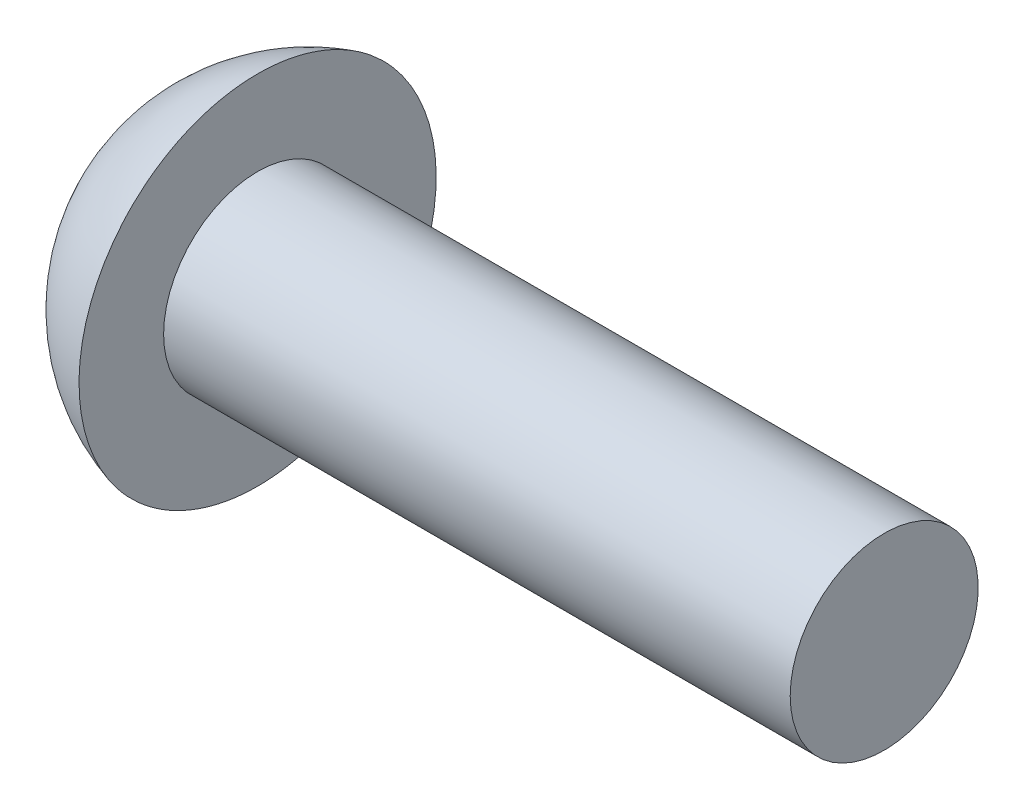
ISO-10303-21;
HEADER;
FILE_DESCRIPTION(('STEP AP214'),'2;1');
FILE_NAME('part.step','',(''),(''),'','','');
FILE_SCHEMA(('AUTOMOTIVE_DESIGN { 1 0 10303 214 1 1 1 1 }'));
ENDSEC;
DATA;
#1=APPLICATION_CONTEXT('core data for automotive mechanical design processes');
#2=APPLICATION_PROTOCOL_DEFINITION('international standard','automotive_design',2000,#1);
#3=PRODUCT_CONTEXT('',#1,'mechanical');
#4=PRODUCT('Part','Part','',(#3));
#5=PRODUCT_RELATED_PRODUCT_CATEGORY('part','',(#4));
#6=PRODUCT_DEFINITION_FORMATION('','',#4);
#7=PRODUCT_DEFINITION_CONTEXT('part definition',#1,'design');
#8=PRODUCT_DEFINITION('design','',#6,#7);
#9=PRODUCT_DEFINITION_SHAPE('','',#8);
#10=(LENGTH_UNIT() NAMED_UNIT(*) SI_UNIT(.MILLI.,.METRE.));
#11=(NAMED_UNIT(*) PLANE_ANGLE_UNIT() SI_UNIT($,.RADIAN.));
#12=(NAMED_UNIT(*) SI_UNIT($,.STERADIAN.) SOLID_ANGLE_UNIT());
#13=UNCERTAINTY_MEASURE_WITH_UNIT(LENGTH_MEASURE(1.E-05),#10,'distance_accuracy_value','');
#14=(GEOMETRIC_REPRESENTATION_CONTEXT(3) GLOBAL_UNCERTAINTY_ASSIGNED_CONTEXT((#13)) GLOBAL_UNIT_ASSIGNED_CONTEXT((#10,
#11,#12)) REPRESENTATION_CONTEXT('',''));
#15=CARTESIAN_POINT('',(0.,0.,0.));
#16=DIRECTION('',(0.,0.,1.));
#17=DIRECTION('',(1.,0.,0.));
#18=AXIS2_PLACEMENT_3D('',#15,#16,#17);
#19=CARTESIAN_POINT('',(1.04,-0.999999999999999,0.577350269189625));
#20=DIRECTION('',(0.86602540378444,-0.499999999999998,0.));
#21=DIRECTION('',(0.499999999999998,0.86602540378444,0.));
#22=AXIS2_PLACEMENT_3D('',#19,#20,#21);
#23=PLANE('',#22);
#24=DIRECTION('',(0.447213595499956,0.774596669241484,-0.447213595499959));
#25=VECTOR('',#24,1.);
#26=CARTESIAN_POINT('',(1.04,-0.999999999999999,0.577350269189625));
#27=LINE('',#26,#25);
#28=CARTESIAN_POINT('',(1.04,-0.999999999999999,0.577350269189625));
#29=VERTEX_POINT('',#28);
#30=CARTESIAN_POINT('',(1.61735026918962,0.,0.));
#31=VERTEX_POINT('',#30);
#32=EDGE_CURVE('E93',#29,#31,#27,.T.);
#33=ORIENTED_EDGE('',*,*,#32,.T.);
#34=DIRECTION('',(-0.447213595499956,-0.774596669241484,-0.447213595499959));
#35=VECTOR('',#34,1.);
#36=CARTESIAN_POINT('',(1.61735026918962,0.,0.));
#37=LINE('',#36,#35);
#38=CARTESIAN_POINT('',(1.04,-0.999999999999999,-0.577350269189628));
#39=VERTEX_POINT('',#38);
#40=EDGE_CURVE('E96',#31,#39,#37,.T.);
#41=ORIENTED_EDGE('',*,*,#40,.T.);
#42=DIRECTION('',(0.,0.,1.));
#43=VECTOR('',#42,1.);
#44=CARTESIAN_POINT('',(1.04,-0.999999999999999,0.577350269189625));
#45=LINE('',#44,#43);
#46=EDGE_CURVE('E91',#29,#39,#45,.F.);
#47=ORIENTED_EDGE('',*,*,#46,.F.);
#48=EDGE_LOOP('',(#33,#41,#47));
#49=FACE_BOUND('',#48,.T.);
#50=ADVANCED_FACE('F39',(#49),#23,.F.);
#51=CARTESIAN_POINT('',(1.04,0.,1.15470053837925));
#52=DIRECTION('',(0.86602540378444,-0.249999999999999,0.433012701892218));
#53=DIRECTION('',(0.447213595499956,0.,-0.894427190999917));
#54=AXIS2_PLACEMENT_3D('',#51,#52,#53);
#55=PLANE('',#54);
#56=DIRECTION('',(0.447213595499956,0.,-0.894427190999917));
#57=VECTOR('',#56,1.);
#58=CARTESIAN_POINT('',(1.27094010767585,0.,0.692820323027549));
#59=LINE('',#58,#57);
#60=CARTESIAN_POINT('',(1.04,0.,1.15470053837925));
#61=VERTEX_POINT('',#60);
#62=EDGE_CURVE('E100',#61,#31,#59,.T.);
#63=ORIENTED_EDGE('',*,*,#62,.T.);
#64=ORIENTED_EDGE('',*,*,#32,.F.);
#65=DIRECTION('',(0.,0.866025403784439,0.5));
#66=VECTOR('',#65,1.);
#67=CARTESIAN_POINT('',(1.04,0.,1.15470053837925));
#68=LINE('',#67,#66);
#69=EDGE_CURVE('E107',#61,#29,#68,.F.);
#70=ORIENTED_EDGE('',*,*,#69,.F.);
#71=EDGE_LOOP('',(#63,#64,#70));
#72=FACE_BOUND('',#71,.T.);
#73=ADVANCED_FACE('F105',(#72),#55,.F.);
#74=CARTESIAN_POINT('',(1.04,1.,0.577350269189625));
#75=DIRECTION('',(0.86602540378444,0.249999999999999,0.433012701892218));
#76=DIRECTION('',(0.447213595499956,0.,-0.894427190999917));
#77=AXIS2_PLACEMENT_3D('',#74,#75,#76);
#78=PLANE('',#77);
#79=DIRECTION('',(0.447213595499956,-0.774596669241484,-0.447213595499959));
#80=VECTOR('',#79,1.);
#81=CARTESIAN_POINT('',(1.04,1.,0.577350269189625));
#82=LINE('',#81,#80);
#83=CARTESIAN_POINT('',(1.04,1.,0.577350269189625));
#84=VERTEX_POINT('',#83);
#85=EDGE_CURVE('E111',#84,#31,#82,.T.);
#86=ORIENTED_EDGE('',*,*,#85,.T.);
#87=ORIENTED_EDGE('',*,*,#62,.F.);
#88=DIRECTION('',(0.,0.866025403784439,-0.5));
#89=VECTOR('',#88,1.);
#90=CARTESIAN_POINT('',(1.04,1.,0.577350269189625));
#91=LINE('',#90,#89);
#92=EDGE_CURVE('E117',#84,#61,#91,.F.);
#93=ORIENTED_EDGE('',*,*,#92,.F.);
#94=EDGE_LOOP('',(#86,#87,#93));
#95=FACE_BOUND('',#94,.T.);
#96=ADVANCED_FACE('F115',(#95),#78,.F.);
#97=CARTESIAN_POINT('',(1.04,1.,-0.577350269189626));
#98=DIRECTION('',(0.86602540378444,0.499999999999998,0.));
#99=DIRECTION('',(-0.499999999999998,0.86602540378444,0.));
#100=AXIS2_PLACEMENT_3D('',#97,#98,#99);
#101=PLANE('',#100);
#102=DIRECTION('',(0.447213595499956,-0.774596669241485,0.447213595499957));
#103=VECTOR('',#102,1.);
#104=CARTESIAN_POINT('',(1.04,1.,-0.577350269189626));
#105=LINE('',#104,#103);
#106=CARTESIAN_POINT('',(1.04,1.,-0.577350269189626));
#107=VERTEX_POINT('',#106);
#108=EDGE_CURVE('E121',#107,#31,#105,.T.);
#109=ORIENTED_EDGE('',*,*,#108,.T.);
#110=ORIENTED_EDGE('',*,*,#85,.F.);
#111=DIRECTION('',(0.,0.,-1.));
#112=VECTOR('',#111,1.);
#113=CARTESIAN_POINT('',(1.04,1.,-0.577350269189626));
#114=LINE('',#113,#112);
#115=EDGE_CURVE('E127',#107,#84,#114,.F.);
#116=ORIENTED_EDGE('',*,*,#115,.F.);
#117=EDGE_LOOP('',(#109,#110,#116));
#118=FACE_BOUND('',#117,.T.);
#119=ADVANCED_FACE('F125',(#118),#101,.F.);
#120=CARTESIAN_POINT('',(1.04,0.,-1.15470053837925));
#121=DIRECTION('',(0.86602540378444,0.249999999999999,-0.433012701892218));
#122=DIRECTION('',(-0.447213595499956,0.,-0.894427190999917));
#123=AXIS2_PLACEMENT_3D('',#120,#121,#122);
#124=PLANE('',#123);
#125=DIRECTION('',(-0.447213595499956,0.,-0.894427190999917));
#126=VECTOR('',#125,1.);
#127=CARTESIAN_POINT('',(1.27094010767585,0.,-0.692820323027552));
#128=LINE('',#127,#126);
#129=CARTESIAN_POINT('',(1.04,0.,-1.15470053837925));
#130=VERTEX_POINT('',#129);
#131=EDGE_CURVE('E131',#130,#31,#128,.F.);
#132=ORIENTED_EDGE('',*,*,#131,.T.);
#133=ORIENTED_EDGE('',*,*,#108,.F.);
#134=DIRECTION('',(0.,-0.866025403784439,-0.5));
#135=VECTOR('',#134,1.);
#136=CARTESIAN_POINT('',(1.04,0.,-1.15470053837925));
#137=LINE('',#136,#135);
#138=EDGE_CURVE('E136',#130,#107,#137,.F.);
#139=ORIENTED_EDGE('',*,*,#138,.F.);
#140=EDGE_LOOP('',(#132,#133,#139));
#141=FACE_BOUND('',#140,.T.);
#142=ADVANCED_FACE('F134',(#141),#124,.F.);
#143=CARTESIAN_POINT('',(1.04,-0.999999999999999,-0.577350269189628));
#144=DIRECTION('',(0.86602540378444,-0.249999999999999,-0.433012701892218));
#145=DIRECTION('',(-0.447213595499956,0.,-0.894427190999917));
#146=AXIS2_PLACEMENT_3D('',#143,#144,#145);
#147=PLANE('',#146);
#148=ORIENTED_EDGE('',*,*,#40,.F.);
#149=ORIENTED_EDGE('',*,*,#131,.F.);
#150=DIRECTION('',(0.,-0.866025403784439,0.5));
#151=VECTOR('',#150,1.);
#152=CARTESIAN_POINT('',(1.04,-0.999999999999999,-0.577350269189628));
#153=LINE('',#152,#151);
#154=EDGE_CURVE('E143',#39,#130,#153,.F.);
#155=ORIENTED_EDGE('',*,*,#154,.F.);
#156=EDGE_LOOP('',(#148,#149,#155));
#157=FACE_BOUND('',#156,.T.);
#158=ADVANCED_FACE('F141',(#157),#147,.F.);
#159=CARTESIAN_POINT('',(1.04,-0.999999999999999,0.577350269189625));
#160=DIRECTION('',(0.,1.,0.));
#161=DIRECTION('',(0.,0.,1.));
#162=AXIS2_PLACEMENT_3D('',#159,#160,#161);
#163=PLANE('',#162);
#164=ORIENTED_EDGE('',*,*,#46,.T.);
#165=DIRECTION('',(1.,0.,0.));
#166=VECTOR('',#165,1.);
#167=CARTESIAN_POINT('',(1.04,-0.999999999999999,-0.577350269189628));
#168=LINE('',#167,#166);
#169=CARTESIAN_POINT('',(0.,-0.999999999999999,-0.577350269189628));
#170=VERTEX_POINT('',#169);
#171=EDGE_CURVE('E194',#170,#39,#168,.T.);
#172=ORIENTED_EDGE('',*,*,#171,.F.);
#173=DIRECTION('',(0.,0.,-1.));
#174=VECTOR('',#173,1.);
#175=CARTESIAN_POINT('',(0.,-0.999999999999999,0.));
#176=LINE('',#175,#174);
#177=CARTESIAN_POINT('',(0.,-0.999999999999999,0.577350269189625));
#178=VERTEX_POINT('',#177);
#179=EDGE_CURVE('E191',#170,#178,#176,.F.);
#180=ORIENTED_EDGE('',*,*,#179,.T.);
#181=DIRECTION('',(1.,0.,0.));
#182=VECTOR('',#181,1.);
#183=CARTESIAN_POINT('',(1.04,-0.999999999999999,0.577350269189625));
#184=LINE('',#183,#182);
#185=EDGE_CURVE('E216',#29,#178,#184,.F.);
#186=ORIENTED_EDGE('',*,*,#185,.F.);
#187=EDGE_LOOP('',(#164,#172,#180,#186));
#188=FACE_BOUND('',#187,.T.);
#189=ADVANCED_FACE('F330',(#188),#163,.T.);
#190=CARTESIAN_POINT('',(1.04,0.,1.15470053837925));
#191=DIRECTION('',(0.,0.5,-0.866025403784439));
#192=DIRECTION('',(0.,0.866025403784439,0.5));
#193=AXIS2_PLACEMENT_3D('',#190,#191,#192);
#194=PLANE('',#193);
#195=ORIENTED_EDGE('',*,*,#69,.T.);
#196=ORIENTED_EDGE('',*,*,#185,.T.);
#197=DIRECTION('',(0.,0.866025403784439,0.5));
#198=VECTOR('',#197,1.);
#199=CARTESIAN_POINT('',(0.,-0.999999999999999,0.577350269189625));
#200=LINE('',#199,#198);
#201=CARTESIAN_POINT('',(0.,0.,1.15470053837925));
#202=VERTEX_POINT('',#201);
#203=EDGE_CURVE('E187',#178,#202,#200,.T.);
#204=ORIENTED_EDGE('',*,*,#203,.T.);
#205=DIRECTION('',(1.,0.,0.));
#206=VECTOR('',#205,1.);
#207=CARTESIAN_POINT('',(1.04,0.,1.15470053837925));
#208=LINE('',#207,#206);
#209=EDGE_CURVE('E210',#61,#202,#208,.F.);
#210=ORIENTED_EDGE('',*,*,#209,.F.);
#211=EDGE_LOOP('',(#195,#196,#204,#210));
#212=FACE_BOUND('',#211,.T.);
#213=ADVANCED_FACE('F222',(#212),#194,.T.);
#214=CARTESIAN_POINT('',(1.04,1.,0.577350269189625));
#215=DIRECTION('',(0.,-0.5,-0.866025403784439));
#216=DIRECTION('',(0.,0.866025403784439,-0.5));
#217=AXIS2_PLACEMENT_3D('',#214,#215,#216);
#218=PLANE('',#217);
#219=ORIENTED_EDGE('',*,*,#92,.T.);
#220=ORIENTED_EDGE('',*,*,#209,.T.);
#221=DIRECTION('',(0.,0.866025403784439,-0.5));
#222=VECTOR('',#221,1.);
#223=CARTESIAN_POINT('',(0.,0.,1.15470053837925));
#224=LINE('',#223,#222);
#225=CARTESIAN_POINT('',(0.,1.,0.577350269189625));
#226=VERTEX_POINT('',#225);
#227=EDGE_CURVE('E182',#202,#226,#224,.T.);
#228=ORIENTED_EDGE('',*,*,#227,.T.);
#229=DIRECTION('',(1.,0.,0.));
#230=VECTOR('',#229,1.);
#231=CARTESIAN_POINT('',(1.04,1.,0.577350269189625));
#232=LINE('',#231,#230);
#233=EDGE_CURVE('E204',#84,#226,#232,.F.);
#234=ORIENTED_EDGE('',*,*,#233,.F.);
#235=EDGE_LOOP('',(#219,#220,#228,#234));
#236=FACE_BOUND('',#235,.T.);
#237=ADVANCED_FACE('F226',(#236),#218,.T.);
#238=CARTESIAN_POINT('',(1.04,1.,-0.577350269189626));
#239=DIRECTION('',(0.,-1.,0.));
#240=DIRECTION('',(0.,0.,-1.));
#241=AXIS2_PLACEMENT_3D('',#238,#239,#240);
#242=PLANE('',#241);
#243=ORIENTED_EDGE('',*,*,#115,.T.);
#244=ORIENTED_EDGE('',*,*,#233,.T.);
#245=DIRECTION('',(0.,0.,-1.));
#246=VECTOR('',#245,1.);
#247=CARTESIAN_POINT('',(0.,1.,0.));
#248=LINE('',#247,#246);
#249=CARTESIAN_POINT('',(0.,1.,-0.577350269189626));
#250=VERTEX_POINT('',#249);
#251=EDGE_CURVE('E178',#226,#250,#248,.T.);
#252=ORIENTED_EDGE('',*,*,#251,.T.);
#253=DIRECTION('',(1.,0.,0.));
#254=VECTOR('',#253,1.);
#255=CARTESIAN_POINT('',(1.04,1.,-0.577350269189626));
#256=LINE('',#255,#254);
#257=EDGE_CURVE('E199',#107,#250,#256,.F.);
#258=ORIENTED_EDGE('',*,*,#257,.F.);
#259=EDGE_LOOP('',(#243,#244,#252,#258));
#260=FACE_BOUND('',#259,.T.);
#261=ADVANCED_FACE('F229',(#260),#242,.T.);
#262=CARTESIAN_POINT('',(1.04,0.,-1.15470053837925));
#263=DIRECTION('',(0.,-0.5,0.866025403784439));
#264=DIRECTION('',(0.,-0.866025403784439,-0.5));
#265=AXIS2_PLACEMENT_3D('',#262,#263,#264);
#266=PLANE('',#265);
#267=ORIENTED_EDGE('',*,*,#138,.T.);
#268=ORIENTED_EDGE('',*,*,#257,.T.);
#269=DIRECTION('',(0.,-0.866025403784439,-0.5));
#270=VECTOR('',#269,1.);
#271=CARTESIAN_POINT('',(0.,1.,-0.577350269189626));
#272=LINE('',#271,#270);
#273=CARTESIAN_POINT('',(0.,0.,-1.15470053837925));
#274=VERTEX_POINT('',#273);
#275=EDGE_CURVE('E55',#250,#274,#272,.T.);
#276=ORIENTED_EDGE('',*,*,#275,.T.);
#277=DIRECTION('',(1.,0.,0.));
#278=VECTOR('',#277,1.);
#279=CARTESIAN_POINT('',(1.04,0.,-1.15470053837925));
#280=LINE('',#279,#278);
#281=EDGE_CURVE('E231',#130,#274,#280,.F.);
#282=ORIENTED_EDGE('',*,*,#281,.F.);
#283=EDGE_LOOP('',(#267,#268,#276,#282));
#284=FACE_BOUND('',#283,.T.);
#285=ADVANCED_FACE('F230',(#284),#266,.T.);
#286=CARTESIAN_POINT('',(1.04,-0.999999999999999,-0.577350269189628));
#287=DIRECTION('',(0.,0.5,0.866025403784439));
#288=DIRECTION('',(0.,-0.866025403784439,0.5));
#289=AXIS2_PLACEMENT_3D('',#286,#287,#288);
#290=PLANE('',#289);
#291=ORIENTED_EDGE('',*,*,#154,.T.);
#292=ORIENTED_EDGE('',*,*,#281,.T.);
#293=DIRECTION('',(0.,-0.866025403784439,0.5));
#294=VECTOR('',#293,1.);
#295=CARTESIAN_POINT('',(0.,0.,-1.15470053837925));
#296=LINE('',#295,#294);
#297=EDGE_CURVE('E256',#274,#170,#296,.T.);
#298=ORIENTED_EDGE('',*,*,#297,.T.);
#299=ORIENTED_EDGE('',*,*,#171,.T.);
#300=EDGE_LOOP('',(#291,#292,#298,#299));
#301=FACE_BOUND('',#300,.T.);
#302=ADVANCED_FACE('F236',(#301),#290,.T.);
#303=CARTESIAN_POINT('',(0.,0.,0.));
#304=DIRECTION('',(1.,0.,0.));
#305=DIRECTION('',(0.,0.,-1.));
#306=AXIS2_PLACEMENT_3D('',#303,#304,#305);
#307=PLANE('',#306);
#308=ORIENTED_EDGE('',*,*,#275,.F.);
#309=ORIENTED_EDGE('',*,*,#251,.F.);
#310=ORIENTED_EDGE('',*,*,#227,.F.);
#311=ORIENTED_EDGE('',*,*,#203,.F.);
#312=ORIENTED_EDGE('',*,*,#179,.F.);
#313=ORIENTED_EDGE('',*,*,#297,.F.);
#314=EDGE_LOOP('',(#308,#309,#310,#311,#312,#313));
#315=FACE_BOUND('',#314,.T.);
#316=CARTESIAN_POINT('',(0.,1.65,0.));
#317=CARTESIAN_POINT('',(0.,1.64999475628625,0.0926122838063657));
#318=CARTESIAN_POINT('',(3.05898607916328E-13,1.64215978150358,0.18538939125107));
#319=CARTESIAN_POINT('',(-1.53351340608703E-13,1.61884585818146,0.322500922932766));
#320=CARTESIAN_POINT('',(-4.50330102517895E-13,1.60912731006566,0.367920519535546));
#321=CARTESIAN_POINT('',(4.50696310098876E-13,1.58589151201533,0.457824431536528));
#322=CARTESIAN_POINT('',(1.64991739910174E-12,1.57237117941051,0.502307956330261));
#323=CARTESIAN_POINT('',(2.73007966094236E-12,1.52629349808163,0.633652728784909));
#324=CARTESIAN_POINT('',(1.11209753632811E-13,1.48818162061822,0.718629249529157));
#325=CARTESIAN_POINT('',(-1.11213981633305E-13,1.39821389709384,0.88097098656055));
#326=CARTESIAN_POINT('',(2.28542286774844E-12,1.34635752856629,0.958335913356376));
#327=CARTESIAN_POINT('',(1.43558397308643E-12,1.25943801543863,1.06699419444925));
#328=CARTESIAN_POINT('',(4.09377236579174E-13,1.22891940035784,1.10200257307872));
#329=CARTESIAN_POINT('',(-4.08982535264704E-13,1.16507583146925,1.16929371559786));
#330=CARTESIAN_POINT('',(-2.02324430288588E-13,1.13175361176435,1.20157907484735));
#331=CARTESIAN_POINT('',(4.04519047964304E-13,1.02784793386739,1.29406800558064));
#332=CARTESIAN_POINT('',(7.91714517445034E-13,0.953306618166003,1.34992793323473));
#333=CARTESIAN_POINT('',(6.41169912511176E-13,0.795944396186136,1.44830738351795));
#334=CARTESIAN_POINT('',(1.03464719658415E-13,0.713123802262043,1.4908274091746));
#335=CARTESIAN_POINT('',(-1.0346361458411E-13,0.541510433473779,1.56136736420223));
#336=CARTESIAN_POINT('',(2.27303968102346E-13,0.452717722406053,1.58938744843934));
#337=CARTESIAN_POINT('',(3.00052162846325E-13,0.271690468516389,1.63012070855377));
#338=CARTESIAN_POINT('',(0.,0.179455907316224,1.64283380268526));
#339=CARTESIAN_POINT('',(0.,-0.00583846643853407,1.65259590893401));
#340=CARTESIAN_POINT('',(1.31933640701098E-13,-0.0988982789931269,1.64964492105128));
#341=CARTESIAN_POINT('',(1.59499829655953E-13,-0.283203510106528,1.62815895087065));
#342=CARTESIAN_POINT('',(0.,-0.374448938352222,1.60962405179717));
#343=CARTESIAN_POINT('',(0.,-0.552524395791296,1.55750721133294));
#344=CARTESIAN_POINT('',(1.07084564198388E-13,-0.639354377814266,1.52392510922982));
#345=CARTESIAN_POINT('',(1.39246775868807E-13,-0.806182871135907,1.44262542312685));
#346=CARTESIAN_POINT('',(0.,-0.886181124665969,1.39490730606296));
#347=CARTESIAN_POINT('',(0.,-0.999230046467636,1.31384847874074));
#348=CARTESIAN_POINT('',(0.,-1.03576024500621,1.28524324595618));
#349=CARTESIAN_POINT('',(0.,-1.10632113082031,1.2250331094087));
#350=CARTESIAN_POINT('',(1.42646866616883E-13,-1.14034937184121,1.19342533736241));
#351=CARTESIAN_POINT('',(2.50641519805975E-13,-1.23820518896636,1.09450181706908));
#352=CARTESIAN_POINT('',(0.,-1.29790375712784,1.02301408515312));
#353=CARTESIAN_POINT('',(0.,-1.40443180464718,0.871024592258884));
#354=CARTESIAN_POINT('',(0.,-1.45126177316042,0.790523174068533));
#355=CARTESIAN_POINT('',(0.,-1.51088568274003,0.664747217008587));
#356=CARTESIAN_POINT('',(0.,-1.5290053618036,0.621930624401761));
#357=CARTESIAN_POINT('',(0.,-1.56155935882147,0.534965959265291));
#358=CARTESIAN_POINT('',(0.,-1.57599665930636,0.490818996881043));
#359=CARTESIAN_POINT('',(0.,-1.61358878249043,0.356916258240854));
#360=CARTESIAN_POINT('',(0.,-1.63112912042799,0.265476031640657));
#361=CARTESIAN_POINT('',(0.,-1.64391044500751,0.144577174972478));
#362=CARTESIAN_POINT('',(0.,-1.64619205712785,0.115712936486685));
#363=CARTESIAN_POINT('',(0.,-1.64923765449147,0.0579045043900754));
#364=CARTESIAN_POINT('',(0.,-1.65000163973475,0.0289603107792577));
#365=CARTESIAN_POINT('',(0.,-1.64999475628625,-0.0926122838063663));
#366=CARTESIAN_POINT('',(3.06231663189347E-13,-1.64215978150358,-0.185389391251071));
#367=CARTESIAN_POINT('',(-1.53518305973345E-13,-1.61884585818146,-0.322500922932767));
#368=CARTESIAN_POINT('',(-4.5071564679152E-13,-1.60912731006566,-0.367920519535547));
#369=CARTESIAN_POINT('',(4.51082167896369E-13,-1.58589151201533,-0.457824431536529));
#370=CARTESIAN_POINT('',(1.65129422082248E-12,-1.57237117941051,-0.502307956330262));
#371=CARTESIAN_POINT('',(2.73252848185343E-12,-1.52629349808163,-0.633652728784909));
#372=CARTESIAN_POINT('',(1.11852479852063E-13,-1.48818162061822,-0.718629249529158));
#373=CARTESIAN_POINT('',(-1.11856732287884E-13,-1.39821389709384,-0.88097098656055));
#374=CARTESIAN_POINT('',(2.28530082337201E-12,-1.34635752856629,-0.958335913356375));
#375=CARTESIAN_POINT('',(1.4356450752365E-12,-1.25943801543863,-1.06699419444925));
#376=CARTESIAN_POINT('',(4.09399514034752E-13,-1.22891940035784,-1.10200257307872));
#377=CARTESIAN_POINT('',(-4.09004791241459E-13,-1.16507583146925,-1.16929371559786));
#378=CARTESIAN_POINT('',(-2.02352426895856E-13,-1.13175361176435,-1.20157907484735));
#379=CARTESIAN_POINT('',(4.04575023216043E-13,-1.02784793386739,-1.29406800558064));
#380=CARTESIAN_POINT('',(7.91961330329439E-13,-0.953306618166003,-1.34992793323473));
#381=CARTESIAN_POINT('',(6.40923108934829E-13,-0.795944396186136,-1.44830738351795));
#382=CARTESIAN_POINT('',(1.02533494998275E-13,-0.713123802262043,-1.49082740917461));
#383=CARTESIAN_POINT('',(-1.02532399870088E-13,-0.541510433473779,-1.56136736420223));
#384=CARTESIAN_POINT('',(2.30782008762094E-13,-0.452717722406053,-1.58938744843935));
#385=CARTESIAN_POINT('',(3.03513016044591E-13,-0.271690468516389,-1.63012070855377));
#386=CARTESIAN_POINT('',(0.,-0.179455907316224,-1.64283380268526));
#387=CARTESIAN_POINT('',(0.,0.00583846643853428,-1.65259590893401));
#388=CARTESIAN_POINT('',(1.31807243911146E-13,0.0988982789931273,-1.64964492105128));
#389=CARTESIAN_POINT('',(1.59626225770898E-13,0.283203510106529,-1.62815895087065));
#390=CARTESIAN_POINT('',(0.,0.374448938352223,-1.60962405179717));
#391=CARTESIAN_POINT('',(0.,0.552524395791297,-1.55750721133294));
#392=CARTESIAN_POINT('',(1.08775867319418E-13,0.639354377814268,-1.52392510922983));
#393=CARTESIAN_POINT('',(1.41024921337305E-13,0.806182871135907,-1.44262542312685));
#394=CARTESIAN_POINT('',(0.,0.886181124665968,-1.39490730606296));
#395=CARTESIAN_POINT('',(0.,0.999230046467636,-1.31384847874074));
#396=CARTESIAN_POINT('',(0.,1.03576024500621,-1.28524324595618));
#397=CARTESIAN_POINT('',(0.,1.10632113082031,-1.2250331094087));
#398=CARTESIAN_POINT('',(1.4397720305072E-13,1.14034937184121,-1.19342533736241));
#399=CARTESIAN_POINT('',(2.53183958956949E-13,1.23820518896636,-1.09450181706908));
#400=CARTESIAN_POINT('',(0.,1.29790375712784,-1.02301408515312));
#401=CARTESIAN_POINT('',(0.,1.40443180464718,-0.871024592258883));
#402=CARTESIAN_POINT('',(0.,1.45126177316041,-0.790523174068531));
#403=CARTESIAN_POINT('',(0.,1.51088568274002,-0.664747217008586));
#404=CARTESIAN_POINT('',(0.,1.5290053618036,-0.62193062440176));
#405=CARTESIAN_POINT('',(0.,1.56155935882147,-0.53496595926529));
#406=CARTESIAN_POINT('',(0.,1.57599665930637,-0.490818996881042));
#407=CARTESIAN_POINT('',(0.,1.61358878249043,-0.356916258240852));
#408=CARTESIAN_POINT('',(0.,1.63112912042799,-0.265476031640656));
#409=CARTESIAN_POINT('',(0.,1.64391044500751,-0.144577174972477));
#410=CARTESIAN_POINT('',(0.,1.64619205712785,-0.115712936486685));
#411=CARTESIAN_POINT('',(0.,1.64923765449147,-0.0579045043900753));
#412=CARTESIAN_POINT('',(0.,1.65000163973475,-0.028960310779258));
#413=CARTESIAN_POINT('',(0.,1.65,0.));
#414=B_SPLINE_CURVE_WITH_KNOTS('',3,(#316,#317,#318,#319,#320,#321,#322,#323,#324,#325,#326,
#327,#328,#329,#330,#331,#332,#333,#334,#335,#336,#337,#338,#339,#340,#341,#342,#343,#344,#345,
#346,#347,#348,#349,#350,#351,#352,#353,#354,#355,#356,#357,#358,#359,#360,#361,#362,#363,#364,
#365,#366,#367,#368,#369,#370,#371,#372,#373,#374,#375,#376,#377,#378,#379,#380,#381,#382,#383,
#384,#385,#386,#387,#388,#389,#390,#391,#392,#393,#394,#395,#396,#397,#398,#399,#400,#401,#402,
#403,#404,#405,#406,#407,#408,#409,#410,#411,#412,#413),.UNSPECIFIED.,.T.,.F.,(4,2,2,2,2,2,2,2,
2,2,2,2,2,2,2,2,2,2,2,2,2,2,2,2,2,2,2,2,2,2,2,2,2,2,2,2,2,2,2,2,2,2,2,2,2,2,2,2,4),(0.,
0.277702091269804,0.41691811541632,0.556247349768307,0.834241652472964,1.11224652403521,
1.25143110493622,1.39048149093793,1.66849304734885,1.94649411910442,2.2244922216175,
2.50249180875174,2.78049139588597,3.05848949839889,3.33649057015431,3.61450212656489,
3.75355251256641,3.89273709346727,4.17074196502988,4.44873626773494,4.58806550208719,
4.72728152623392,5.00498361750399,5.0918224096888,5.17866120187363,5.45636329314344,
5.59557931728995,5.73490855164194,6.0129028543466,6.29090772590884,6.43009230680985,
6.56914269281156,6.84715424922248,7.12515532097805,7.40315342349114,7.68115301062537,
7.9591525977596,8.23715070027253,8.51515177202795,8.79316332843852,8.93221371444005,
9.0713982953409,9.34940316690351,9.62739746960857,9.76672670396082,9.90594272810756,
10.1836448193776,10.2704836115624,10.3573224037473),.UNSPECIFIED.);
#415=CARTESIAN_POINT('',(0.,1.65,0.));
#416=VERTEX_POINT('',#415);
#417=EDGE_CURVE('E259',#416,#416,#414,.T.);
#418=ORIENTED_EDGE('',*,*,#417,.F.);
#419=EDGE_LOOP('',(#418));
#420=FACE_BOUND('',#419,.T.);
#421=ADVANCED_FACE('F282',(#315,#420),#307,.F.);
#422=CARTESIAN_POINT('',(2.46136363636364,0.,0.));
#423=DIRECTION('',(0.,1.,0.));
#424=DIRECTION('',(1.,0.,0.));
#425=AXIS2_PLACEMENT_3D('',#422,#423,#424);
#426=SPHERICAL_SURFACE('',#425,2.96324331610032);
#427=CARTESIAN_POINT('',(1.65,2.85,0.));
#428=CARTESIAN_POINT('',(1.65,2.85000057906976,0.0994755209320721));
#429=CARTESIAN_POINT('',(1.65,2.84478547555247,0.198942482848534));
#430=CARTESIAN_POINT('',(1.65,2.82399280002999,0.396836737907106));
#431=CARTESIAN_POINT('',(1.65,2.80840816724578,0.495263276184495));
#432=CARTESIAN_POINT('',(1.65,2.75440000240514,0.749242112145294));
#433=CARTESIAN_POINT('',(1.65,2.70785158725828,0.903143571263676));
#434=CARTESIAN_POINT('',(1.65,2.58954254676245,1.2010464138126));
#435=CARTESIAN_POINT('',(1.65,2.51775552221799,1.34503724156705));
#436=CARTESIAN_POINT('',(1.65,2.35104541884365,1.61887527587051));
#437=CARTESIAN_POINT('',(1.65,2.25613186306112,1.74872827233573));
#438=CARTESIAN_POINT('',(1.65,2.04587420380713,1.99062244679212));
#439=CARTESIAN_POINT('',(1.65,1.93053472107182,2.10266764239451));
#440=CARTESIAN_POINT('',(1.65,1.68267182902306,2.30581717966137));
#441=CARTESIAN_POINT('',(1.65,1.55014681022033,2.39691955773461));
#442=CARTESIAN_POINT('',(1.65,1.2716779031301,2.5555853934218));
#443=CARTESIAN_POINT('',(1.65,1.12573349793572,2.62314794381493));
#444=CARTESIAN_POINT('',(1.65,0.824575912841222,2.73281071941687));
#445=CARTESIAN_POINT('',(1.65,0.669362898478292,2.77491139922488));
#446=CARTESIAN_POINT('',(1.65,0.354072234455394,2.8324570148682));
#447=CARTESIAN_POINT('',(1.65,0.193994598538578,2.84790202600193));
#448=CARTESIAN_POINT('',(1.65,-0.12648169106302,2.85169813605542));
#449=CARTESIAN_POINT('',(1.65,-0.286880344916065,2.84004922077003));
#450=CARTESIAN_POINT('',(1.65,-0.603445629886834,2.78998804921158));
#451=CARTESIAN_POINT('',(1.65,-0.759612253486785,2.75157574539931));
#452=CARTESIAN_POINT('',(1.65,-1.06328211070496,2.64907756110034));
#453=CARTESIAN_POINT('',(1.65,-1.21078522747977,2.58499133444442));
#454=CARTESIAN_POINT('',(1.65,-1.49293445312084,2.43296640675748));
#455=CARTESIAN_POINT('',(1.65,-1.6275809314192,2.34502839138033));
#456=CARTESIAN_POINT('',(1.65,-1.88019058151188,2.14780356775386));
#457=CARTESIAN_POINT('',(1.65,-1.99815491915891,2.03851825266025));
#458=CARTESIAN_POINT('',(1.65,-2.21408212671816,1.80167172570829));
#459=CARTESIAN_POINT('',(1.65,-2.31204162107743,1.67410743568376));
#460=CARTESIAN_POINT('',(1.65,-2.48517751699648,1.40431562659077));
#461=CARTESIAN_POINT('',(1.65,-2.56034696289972,1.26208364857235));
#462=CARTESIAN_POINT('',(1.65,-2.68568468172619,0.967075845543692));
#463=CARTESIAN_POINT('',(1.65,-2.73587236333606,0.814308311153059));
#464=CARTESIAN_POINT('',(1.65,-2.79848597794055,0.550712885297144));
#465=CARTESIAN_POINT('',(1.65,-2.81778183306119,0.441462069456978));
#466=CARTESIAN_POINT('',(1.65,-2.84353610138701,0.221470248796431));
#467=CARTESIAN_POINT('',(1.65,-2.84999935541638,0.110729821777302));
#468=CARTESIAN_POINT('',(1.65,-2.85000057906976,-0.0994755209320727));
#469=CARTESIAN_POINT('',(1.65,-2.84478547555247,-0.198942482848534));
#470=CARTESIAN_POINT('',(1.65,-2.82399280002999,-0.396836737907107));
#471=CARTESIAN_POINT('',(1.65,-2.80840816724578,-0.495263276184496));
#472=CARTESIAN_POINT('',(1.65,-2.75440000240514,-0.749242112145295));
#473=CARTESIAN_POINT('',(1.65,-2.70785158725828,-0.903143571263677));
#474=CARTESIAN_POINT('',(1.65,-2.58954254676245,-1.2010464138126));
#475=CARTESIAN_POINT('',(1.65,-2.51775552221799,-1.34503724156705));
#476=CARTESIAN_POINT('',(1.65,-2.35104541884365,-1.61887527587051));
#477=CARTESIAN_POINT('',(1.65,-2.25613186306112,-1.74872827233573));
#478=CARTESIAN_POINT('',(1.65,-2.04587420380713,-1.99062244679212));
#479=CARTESIAN_POINT('',(1.65,-1.93053472107182,-2.10266764239451));
#480=CARTESIAN_POINT('',(1.65,-1.68267182902306,-2.30581717966137));
#481=CARTESIAN_POINT('',(1.65,-1.55014681022033,-2.39691955773461));
#482=CARTESIAN_POINT('',(1.65,-1.2716779031301,-2.5555853934218));
#483=CARTESIAN_POINT('',(1.65,-1.12573349793572,-2.62314794381493));
#484=CARTESIAN_POINT('',(1.65,-0.824575912841221,-2.73281071941687));
#485=CARTESIAN_POINT('',(1.65,-0.669362898478291,-2.77491139922488));
#486=CARTESIAN_POINT('',(1.65,-0.354072234455393,-2.8324570148682));
#487=CARTESIAN_POINT('',(1.65,-0.193994598538577,-2.84790202600193));
#488=CARTESIAN_POINT('',(1.65,0.126481691063021,-2.85169813605542));
#489=CARTESIAN_POINT('',(1.65,0.286880344916066,-2.84004922077003));
#490=CARTESIAN_POINT('',(1.65,0.603445629886835,-2.78998804921158));
#491=CARTESIAN_POINT('',(1.65,0.759612253486786,-2.75157574539931));
#492=CARTESIAN_POINT('',(1.65,1.06328211070496,-2.64907756110034));
#493=CARTESIAN_POINT('',(1.65,1.21078522747977,-2.58499133444442));
#494=CARTESIAN_POINT('',(1.65,1.49293445312084,-2.43296640675748));
#495=CARTESIAN_POINT('',(1.65,1.6275809314192,-2.34502839138033));
#496=CARTESIAN_POINT('',(1.65,1.88019058151188,-2.14780356775386));
#497=CARTESIAN_POINT('',(1.65,1.99815491915891,-2.03851825266025));
#498=CARTESIAN_POINT('',(1.65,2.21408212671816,-1.80167172570829));
#499=CARTESIAN_POINT('',(1.65,2.31204162107743,-1.67410743568376));
#500=CARTESIAN_POINT('',(1.65,2.48517751699648,-1.40431562659077));
#501=CARTESIAN_POINT('',(1.65,2.56034696289972,-1.26208364857235));
#502=CARTESIAN_POINT('',(1.65,2.68568468172619,-0.967075845543692));
#503=CARTESIAN_POINT('',(1.65,2.73587236333606,-0.81430831115306));
#504=CARTESIAN_POINT('',(1.65,2.79848597794055,-0.550712885297145));
#505=CARTESIAN_POINT('',(1.65,2.81778183306119,-0.441462069456979));
#506=CARTESIAN_POINT('',(1.65,2.84353610138701,-0.221470248796432));
#507=CARTESIAN_POINT('',(1.65,2.84999935541638,-0.110729821777302));
#508=CARTESIAN_POINT('',(1.65,2.85,0.));
#509=B_SPLINE_CURVE_WITH_KNOTS('',3,(#427,#428,#429,#430,#431,#432,#433,#434,#435,#436,#437,
#438,#439,#440,#441,#442,#443,#444,#445,#446,#447,#448,#449,#450,#451,#452,#453,#454,#455,#456,
#457,#458,#459,#460,#461,#462,#463,#464,#465,#466,#467,#468,#469,#470,#471,#472,#473,#474,#475,
#476,#477,#478,#479,#480,#481,#482,#483,#484,#485,#486,#487,#488,#489,#490,#491,#492,#493,#494,
#495,#496,#497,#498,#499,#500,#501,#502,#503,#504,#505,#506,#507,#508),.UNSPECIFIED.,.T.,.F.,(4,
2,2,2,2,2,2,2,2,2,2,2,2,2,2,2,2,2,2,2,2,2,2,2,2,2,2,2,2,2,2,2,2,2,2,2,2,2,2,2,4),(0.,
0.29826452288417,0.596732346995355,1.0766617018349,1.55709455624476,2.03732991126998,
2.51745676630635,2.99762861952438,3.47781897643476,3.95800075971781,4.43818118655454,
4.91836186514658,5.39854339667506,5.87873140285338,6.35890560680169,6.83904623656087,
7.31926781688604,7.7996358164522,8.27963002653375,8.61176443376487,8.94377352657484,
9.24203804945901,9.5405058735702,10.0204352284097,10.5008680828196,10.9811034378448,
11.4612302928812,11.9414021460992,12.4215925030096,12.9017742862927,13.3819547131294,
13.8621353917214,14.3423169232499,14.8225049294282,15.3026791333765,15.7828197631357,
16.2630413434609,16.743409343027,17.2234035531086,17.5555379603397,17.8875470531497),.UNSPECIFIED.);
#510=CARTESIAN_POINT('',(1.65,2.85,0.));
#511=VERTEX_POINT('',#510);
#512=EDGE_CURVE('E47',#511,#511,#509,.T.);
#513=ORIENTED_EDGE('',*,*,#512,.F.);
#514=EDGE_LOOP('',(#513));
#515=FACE_BOUND('',#514,.T.);
#516=ORIENTED_EDGE('',*,*,#417,.T.);
#517=EDGE_LOOP('',(#516));
#518=FACE_BOUND('',#517,.T.);
#519=ADVANCED_FACE('F272',(#515,#518),#426,.T.);
#520=CARTESIAN_POINT('',(1.65,0.,0.));
#521=DIRECTION('',(1.,0.,0.));
#522=DIRECTION('',(0.,0.,-1.));
#523=AXIS2_PLACEMENT_3D('',#520,#521,#522);
#524=PLANE('',#523);
#525=CARTESIAN_POINT('',(1.65,0.,0.));
#526=DIRECTION('',(1.,0.,0.));
#527=DIRECTION('',(0.,0.,-1.));
#528=AXIS2_PLACEMENT_3D('',#525,#526,#527);
#529=CIRCLE('',#528,1.5);
#530=CARTESIAN_POINT('',(1.65,0.,-1.5));
#531=VERTEX_POINT('',#530);
#532=EDGE_CURVE('E12',#531,#531,#529,.T.);
#533=ORIENTED_EDGE('',*,*,#532,.F.);
#534=EDGE_LOOP('',(#533));
#535=FACE_BOUND('',#534,.T.);
#536=ORIENTED_EDGE('',*,*,#512,.T.);
#537=EDGE_LOOP('',(#536));
#538=FACE_BOUND('',#537,.T.);
#539=ADVANCED_FACE('F266',(#535,#538),#524,.T.);
#540=CARTESIAN_POINT('',(11.65,0.,0.));
#541=DIRECTION('',(-1.,0.,0.));
#542=DIRECTION('',(0.,0.,1.));
#543=AXIS2_PLACEMENT_3D('',#540,#541,#542);
#544=CYLINDRICAL_SURFACE('',#543,1.5);
#545=CARTESIAN_POINT('',(11.65,0.,0.));
#546=DIRECTION('',(-1.,0.,0.));
#547=DIRECTION('',(0.,0.,1.));
#548=AXIS2_PLACEMENT_3D('',#545,#546,#547);
#549=CIRCLE('',#548,1.5);
#550=CARTESIAN_POINT('',(11.65,0.,1.5));
#551=VERTEX_POINT('',#550);
#552=EDGE_CURVE('E101',#551,#551,#549,.T.);
#553=ORIENTED_EDGE('',*,*,#552,.T.);
#554=EDGE_LOOP('',(#553));
#555=FACE_BOUND('',#554,.T.);
#556=ORIENTED_EDGE('',*,*,#532,.T.);
#557=EDGE_LOOP('',(#556));
#558=FACE_BOUND('',#557,.T.);
#559=ADVANCED_FACE('F271',(#555,#558),#544,.T.);
#560=CARTESIAN_POINT('',(11.65,1.5,0.));
#561=DIRECTION('',(1.,0.,0.));
#562=DIRECTION('',(0.,0.,-1.));
#563=AXIS2_PLACEMENT_3D('',#560,#561,#562);
#564=PLANE('',#563);
#565=ORIENTED_EDGE('',*,*,#552,.F.);
#566=EDGE_LOOP('',(#565));
#567=FACE_BOUND('',#566,.T.);
#568=ADVANCED_FACE('F396',(#567),#564,.T.);
#569=CLOSED_SHELL('',(#50,#73,#96,#119,#142,#158,#189,#213,#237,#261,#285,#302,#421,#519,#539,
#559,#568));
#570=MANIFOLD_SOLID_BREP('B2',#569);
#571=ADVANCED_BREP_SHAPE_REPRESENTATION('',(#18,#570),#14);
#572=SHAPE_DEFINITION_REPRESENTATION(#9,#571);
ENDSEC;
END-ISO-10303-21;
